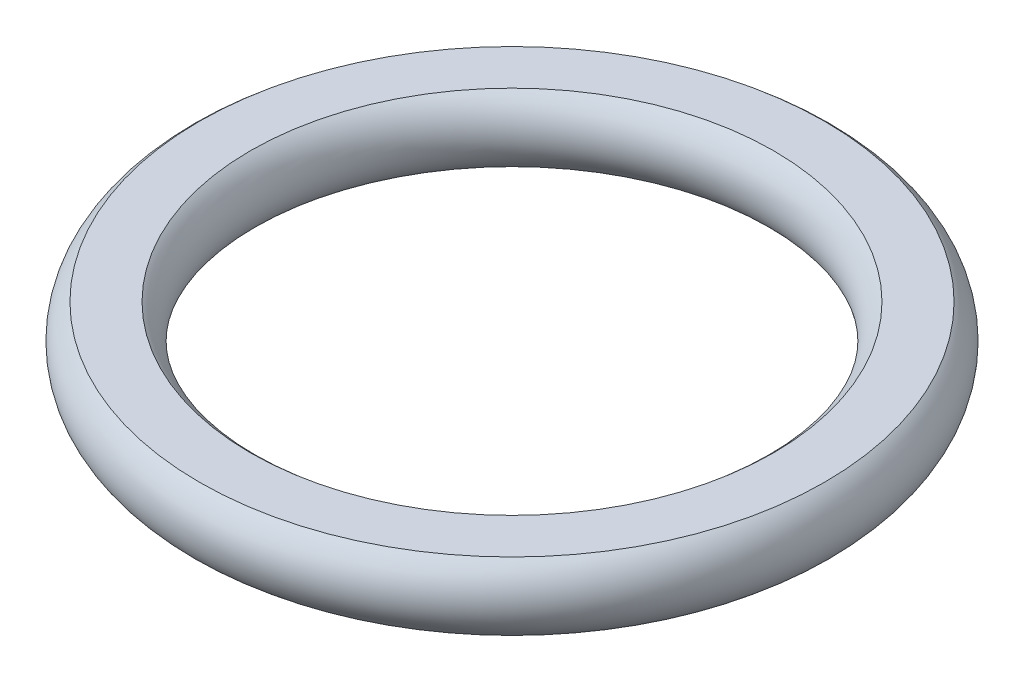
ISO-10303-21;
HEADER;
FILE_DESCRIPTION(('STEP AP214'),'2;1');
FILE_NAME('part.step','',(''),(''),'','','');
FILE_SCHEMA(('AUTOMOTIVE_DESIGN { 1 0 10303 214 1 1 1 1 }'));
ENDSEC;
DATA;
#1=APPLICATION_CONTEXT('core data for automotive mechanical design processes');
#2=APPLICATION_PROTOCOL_DEFINITION('international standard','automotive_design',2000,#1);
#3=PRODUCT_CONTEXT('',#1,'mechanical');
#4=PRODUCT('Part','Part','',(#3));
#5=PRODUCT_RELATED_PRODUCT_CATEGORY('part','',(#4));
#6=PRODUCT_DEFINITION_FORMATION('','',#4);
#7=PRODUCT_DEFINITION_CONTEXT('part definition',#1,'design');
#8=PRODUCT_DEFINITION('design','',#6,#7);
#9=PRODUCT_DEFINITION_SHAPE('','',#8);
#10=(LENGTH_UNIT() NAMED_UNIT(*) SI_UNIT(.MILLI.,.METRE.));
#11=(NAMED_UNIT(*) PLANE_ANGLE_UNIT() SI_UNIT($,.RADIAN.));
#12=(NAMED_UNIT(*) SI_UNIT($,.STERADIAN.) SOLID_ANGLE_UNIT());
#13=UNCERTAINTY_MEASURE_WITH_UNIT(LENGTH_MEASURE(1.E-05),#10,'distance_accuracy_value','');
#14=(GEOMETRIC_REPRESENTATION_CONTEXT(3) GLOBAL_UNCERTAINTY_ASSIGNED_CONTEXT((#13)) GLOBAL_UNIT_ASSIGNED_CONTEXT((#10,
#11,#12)) REPRESENTATION_CONTEXT('',''));
#15=CARTESIAN_POINT('',(0.,0.,0.));
#16=DIRECTION('',(0.,0.,1.));
#17=DIRECTION('',(1.,0.,0.));
#18=AXIS2_PLACEMENT_3D('',#15,#16,#17);
#19=CARTESIAN_POINT('',(16.9,-2.,0.));
#20=DIRECTION('',(0.,-1.,0.));
#21=DIRECTION('',(0.,0.,-1.));
#22=AXIS2_PLACEMENT_3D('',#19,#20,#21);
#23=PLANE('',#22);
#24=CARTESIAN_POINT('',(16.9,-2.,0.));
#25=DIRECTION('',(0.,-1.,0.));
#26=DIRECTION('',(-1.,0.,0.));
#27=AXIS2_PLACEMENT_3D('',#24,#25,#26);
#28=CIRCLE('',#27,15.4);
#29=CARTESIAN_POINT('',(32.3,-2.,0.));
#30=VERTEX_POINT('',#29);
#31=EDGE_CURVE('E11',#30,#30,#28,.T.);
#32=ORIENTED_EDGE('',*,*,#31,.F.);
#33=EDGE_LOOP('',(#32));
#34=FACE_BOUND('',#33,.T.);
#35=CARTESIAN_POINT('',(16.9,-2.,0.));
#36=DIRECTION('',(0.,1.,0.));
#37=DIRECTION('',(-1.,0.,0.));
#38=AXIS2_PLACEMENT_3D('',#35,#36,#37);
#39=CIRCLE('',#38,18.4);
#40=CARTESIAN_POINT('',(35.3,-2.,0.));
#41=VERTEX_POINT('',#40);
#42=EDGE_CURVE('E56',#41,#41,#39,.T.);
#43=ORIENTED_EDGE('',*,*,#42,.F.);
#44=EDGE_LOOP('',(#43));
#45=FACE_BOUND('',#44,.T.);
#46=ADVANCED_FACE('F17',(#34,#45),#23,.T.);
#47=CARTESIAN_POINT('',(16.9,0.,0.));
#48=DIRECTION('',(0.,-1.,0.));
#49=DIRECTION('',(-1.,0.,0.));
#50=AXIS2_PLACEMENT_3D('',#47,#48,#49);
#51=TOROIDAL_SURFACE('',#50,16.9,2.5);
#52=CARTESIAN_POINT('',(16.9,2.,0.));
#53=DIRECTION('',(0.,-1.,0.));
#54=DIRECTION('',(-1.,0.,0.));
#55=AXIS2_PLACEMENT_3D('',#52,#53,#54);
#56=CIRCLE('',#55,15.4);
#57=CARTESIAN_POINT('',(32.3,2.,0.));
#58=VERTEX_POINT('',#57);
#59=EDGE_CURVE('E21',#58,#58,#56,.T.);
#60=ORIENTED_EDGE('',*,*,#59,.F.);
#61=CARTESIAN_POINT('',(33.8,0.,0.));
#62=DIRECTION('',(0.,0.,1.));
#63=DIRECTION('',(1.,0.,0.));
#64=AXIS2_PLACEMENT_3D('',#61,#62,#63);
#65=CIRCLE('',#64,2.5);
#66=EDGE_CURVE('E28',#58,#30,#65,.T.);
#67=ORIENTED_EDGE('',*,*,#66,.T.);
#68=ORIENTED_EDGE('',*,*,#31,.T.);
#69=ORIENTED_EDGE('',*,*,#66,.F.);
#70=EDGE_LOOP('',(#60,#67,#68,#69));
#71=FACE_BOUND('',#70,.T.);
#72=ADVANCED_FACE('F19',(#71),#51,.T.);
#73=CARTESIAN_POINT('',(16.9,2.,0.));
#74=DIRECTION('',(0.,-1.,0.));
#75=DIRECTION('',(0.,0.,-1.));
#76=AXIS2_PLACEMENT_3D('',#73,#74,#75);
#77=PLANE('',#76);
#78=ORIENTED_EDGE('',*,*,#59,.T.);
#79=EDGE_LOOP('',(#78));
#80=FACE_BOUND('',#79,.T.);
#81=CARTESIAN_POINT('',(16.9,2.,0.));
#82=DIRECTION('',(0.,-1.,0.));
#83=DIRECTION('',(-1.,0.,0.));
#84=AXIS2_PLACEMENT_3D('',#81,#82,#83);
#85=CIRCLE('',#84,18.4);
#86=CARTESIAN_POINT('',(35.3,2.,0.));
#87=VERTEX_POINT('',#86);
#88=EDGE_CURVE('E49',#87,#87,#85,.T.);
#89=ORIENTED_EDGE('',*,*,#88,.F.);
#90=EDGE_LOOP('',(#89));
#91=FACE_BOUND('',#90,.T.);
#92=ADVANCED_FACE('F76',(#80,#91),#77,.F.);
#93=CARTESIAN_POINT('',(16.9,0.,0.));
#94=DIRECTION('',(0.,-1.,0.));
#95=DIRECTION('',(-1.,0.,0.));
#96=AXIS2_PLACEMENT_3D('',#93,#94,#95);
#97=TOROIDAL_SURFACE('',#96,16.9,2.5);
#98=ORIENTED_EDGE('',*,*,#42,.T.);
#99=CARTESIAN_POINT('',(33.8,0.,0.));
#100=DIRECTION('',(0.,0.,1.));
#101=DIRECTION('',(1.,0.,0.));
#102=AXIS2_PLACEMENT_3D('',#99,#100,#101);
#103=CIRCLE('',#102,2.5);
#104=EDGE_CURVE('E53',#41,#87,#103,.T.);
#105=ORIENTED_EDGE('',*,*,#104,.T.);
#106=ORIENTED_EDGE('',*,*,#88,.T.);
#107=ORIENTED_EDGE('',*,*,#104,.F.);
#108=EDGE_LOOP('',(#98,#105,#106,#107));
#109=FACE_BOUND('',#108,.T.);
#110=ADVANCED_FACE('F54',(#109),#97,.T.);
#111=CLOSED_SHELL('',(#46,#72,#92,#110));
#112=MANIFOLD_SOLID_BREP('B1',#111);
#113=ADVANCED_BREP_SHAPE_REPRESENTATION('',(#18,#112),#14);
#114=SHAPE_DEFINITION_REPRESENTATION(#9,#113);
ENDSEC;
END-ISO-10303-21;
